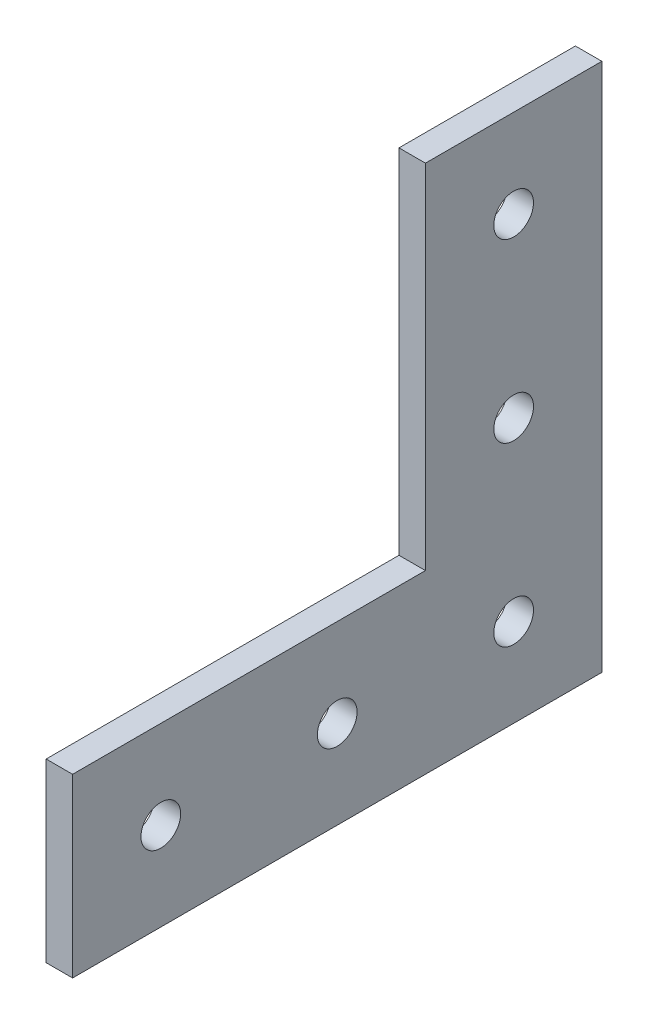
ISO-10303-21;
HEADER;
FILE_DESCRIPTION(('STEP AP214'),'2;1');
FILE_NAME('part.step','',(''),(''),'','','');
FILE_SCHEMA(('AUTOMOTIVE_DESIGN { 1 0 10303 214 1 1 1 1 }'));
ENDSEC;
DATA;
#1=APPLICATION_CONTEXT('core data for automotive mechanical design processes');
#2=APPLICATION_PROTOCOL_DEFINITION('international standard','automotive_design',2000,#1);
#3=PRODUCT_CONTEXT('',#1,'mechanical');
#4=PRODUCT('Part','Part','',(#3));
#5=PRODUCT_RELATED_PRODUCT_CATEGORY('part','',(#4));
#6=PRODUCT_DEFINITION_FORMATION('','',#4);
#7=PRODUCT_DEFINITION_CONTEXT('part definition',#1,'design');
#8=PRODUCT_DEFINITION('design','',#6,#7);
#9=PRODUCT_DEFINITION_SHAPE('','',#8);
#10=(LENGTH_UNIT() NAMED_UNIT(*) SI_UNIT(.MILLI.,.METRE.));
#11=(NAMED_UNIT(*) PLANE_ANGLE_UNIT() SI_UNIT($,.RADIAN.));
#12=(NAMED_UNIT(*) SI_UNIT($,.STERADIAN.) SOLID_ANGLE_UNIT());
#13=UNCERTAINTY_MEASURE_WITH_UNIT(LENGTH_MEASURE(1.E-05),#10,'distance_accuracy_value','');
#14=(GEOMETRIC_REPRESENTATION_CONTEXT(3) GLOBAL_UNCERTAINTY_ASSIGNED_CONTEXT((#13)) GLOBAL_UNIT_ASSIGNED_CONTEXT((#10,
#11,#12)) REPRESENTATION_CONTEXT('',''));
#15=CARTESIAN_POINT('',(0.,0.,0.));
#16=DIRECTION('',(0.,0.,1.));
#17=DIRECTION('',(1.,0.,0.));
#18=AXIS2_PLACEMENT_3D('',#15,#16,#17);
#19=CARTESIAN_POINT('',(6.0031,46.666666666667,46.666666666667));
#20=DIRECTION('',(1.,0.,0.));
#21=DIRECTION('',(0.,0.,-1.));
#22=AXIS2_PLACEMENT_3D('',#19,#20,#21);
#23=PLANE('',#22);
#24=CARTESIAN_POINT('',(6.0031,20.,100.));
#25=DIRECTION('',(1.,0.,0.));
#26=DIRECTION('',(0.,0.,-1.));
#27=AXIS2_PLACEMENT_3D('',#24,#25,#26);
#28=CIRCLE('',#27,4.5);
#29=CARTESIAN_POINT('',(6.0031,20.,95.5));
#30=VERTEX_POINT('',#29);
#31=EDGE_CURVE('E103',#30,#30,#28,.F.);
#32=ORIENTED_EDGE('',*,*,#31,.T.);
#33=EDGE_LOOP('',(#32));
#34=FACE_BOUND('',#33,.T.);
#35=CARTESIAN_POINT('',(6.0031,20.,60.));
#36=DIRECTION('',(1.,0.,0.));
#37=DIRECTION('',(0.,0.,-1.));
#38=AXIS2_PLACEMENT_3D('',#35,#36,#37);
#39=CIRCLE('',#38,4.5);
#40=CARTESIAN_POINT('',(6.0031,20.,55.5));
#41=VERTEX_POINT('',#40);
#42=EDGE_CURVE('E106',#41,#41,#39,.F.);
#43=ORIENTED_EDGE('',*,*,#42,.T.);
#44=EDGE_LOOP('',(#43));
#45=FACE_BOUND('',#44,.T.);
#46=CARTESIAN_POINT('',(6.0031,100.,20.));
#47=DIRECTION('',(1.,0.,0.));
#48=DIRECTION('',(0.,0.,-1.));
#49=AXIS2_PLACEMENT_3D('',#46,#47,#48);
#50=CIRCLE('',#49,4.5);
#51=CARTESIAN_POINT('',(6.0031,100.,15.5));
#52=VERTEX_POINT('',#51);
#53=EDGE_CURVE('E109',#52,#52,#50,.F.);
#54=ORIENTED_EDGE('',*,*,#53,.T.);
#55=EDGE_LOOP('',(#54));
#56=FACE_BOUND('',#55,.T.);
#57=CARTESIAN_POINT('',(6.0031,60.,20.));
#58=DIRECTION('',(1.,0.,0.));
#59=DIRECTION('',(0.,0.,-1.));
#60=AXIS2_PLACEMENT_3D('',#57,#58,#59);
#61=CIRCLE('',#60,4.5);
#62=CARTESIAN_POINT('',(6.0031,60.,15.5));
#63=VERTEX_POINT('',#62);
#64=EDGE_CURVE('E111',#63,#63,#61,.F.);
#65=ORIENTED_EDGE('',*,*,#64,.T.);
#66=EDGE_LOOP('',(#65));
#67=FACE_BOUND('',#66,.T.);
#68=CARTESIAN_POINT('',(6.0031,20.,20.));
#69=DIRECTION('',(1.,0.,0.));
#70=DIRECTION('',(0.,0.,-1.));
#71=AXIS2_PLACEMENT_3D('',#68,#69,#70);
#72=CIRCLE('',#71,4.5);
#73=CARTESIAN_POINT('',(6.0031,20.,15.5));
#74=VERTEX_POINT('',#73);
#75=EDGE_CURVE('E19',#74,#74,#72,.F.);
#76=ORIENTED_EDGE('',*,*,#75,.T.);
#77=EDGE_LOOP('',(#76));
#78=FACE_BOUND('',#77,.T.);
#79=DIRECTION('',(0.,1.,0.));
#80=VECTOR('',#79,1.);
#81=CARTESIAN_POINT('',(6.0031,40.,120.));
#82=LINE('',#81,#80);
#83=CARTESIAN_POINT('',(6.0031,40.,120.));
#84=VERTEX_POINT('',#83);
#85=CARTESIAN_POINT('',(6.0031,0.,120.));
#86=VERTEX_POINT('',#85);
#87=EDGE_CURVE('E125',#84,#86,#82,.F.);
#88=ORIENTED_EDGE('',*,*,#87,.T.);
#89=DIRECTION('',(0.,0.,1.));
#90=VECTOR('',#89,1.);
#91=CARTESIAN_POINT('',(6.0031,0.,120.));
#92=LINE('',#91,#90);
#93=CARTESIAN_POINT('',(6.0031,0.,0.));
#94=VERTEX_POINT('',#93);
#95=EDGE_CURVE('E71',#86,#94,#92,.F.);
#96=ORIENTED_EDGE('',*,*,#95,.T.);
#97=DIRECTION('',(0.,1.,0.));
#98=VECTOR('',#97,1.);
#99=CARTESIAN_POINT('',(6.0031,0.,0.));
#100=LINE('',#99,#98);
#101=CARTESIAN_POINT('',(6.0031,120.,0.));
#102=VERTEX_POINT('',#101);
#103=EDGE_CURVE('E70',#94,#102,#100,.T.);
#104=ORIENTED_EDGE('',*,*,#103,.T.);
#105=DIRECTION('',(0.,0.,-1.));
#106=VECTOR('',#105,1.);
#107=CARTESIAN_POINT('',(6.0031,120.,0.));
#108=LINE('',#107,#106);
#109=CARTESIAN_POINT('',(6.0031,120.,40.));
#110=VERTEX_POINT('',#109);
#111=EDGE_CURVE('E67',#102,#110,#108,.F.);
#112=ORIENTED_EDGE('',*,*,#111,.T.);
#113=DIRECTION('',(0.,1.,0.));
#114=VECTOR('',#113,1.);
#115=CARTESIAN_POINT('',(6.0031,120.,40.));
#116=LINE('',#115,#114);
#117=CARTESIAN_POINT('',(6.0031,40.,40.));
#118=VERTEX_POINT('',#117);
#119=EDGE_CURVE('E135',#110,#118,#116,.F.);
#120=ORIENTED_EDGE('',*,*,#119,.T.);
#121=DIRECTION('',(0.,0.,-1.));
#122=VECTOR('',#121,1.);
#123=CARTESIAN_POINT('',(6.0031,40.,40.));
#124=LINE('',#123,#122);
#125=EDGE_CURVE('E130',#118,#84,#124,.F.);
#126=ORIENTED_EDGE('',*,*,#125,.T.);
#127=EDGE_LOOP('',(#88,#96,#104,#112,#120,#126));
#128=FACE_BOUND('',#127,.T.);
#129=ADVANCED_FACE('F16',(#34,#45,#56,#67,#78,#128),#23,.T.);
#130=CARTESIAN_POINT('',(0.003099999999904,0.,0.));
#131=DIRECTION('',(0.,0.,1.));
#132=DIRECTION('',(1.,0.,0.));
#133=AXIS2_PLACEMENT_3D('',#130,#131,#132);
#134=PLANE('',#133);
#135=DIRECTION('',(1.,0.,0.));
#136=VECTOR('',#135,1.);
#137=CARTESIAN_POINT('',(0.003099999999904,120.,0.));
#138=LINE('',#137,#136);
#139=CARTESIAN_POINT('',(0.0030999999999895,120.,0.));
#140=VERTEX_POINT('',#139);
#141=EDGE_CURVE('E76',#140,#102,#138,.T.);
#142=ORIENTED_EDGE('',*,*,#141,.T.);
#143=ORIENTED_EDGE('',*,*,#103,.F.);
#144=DIRECTION('',(1.,0.,0.));
#145=VECTOR('',#144,1.);
#146=CARTESIAN_POINT('',(0.003099999999904,0.,0.));
#147=LINE('',#146,#145);
#148=CARTESIAN_POINT('',(0.0030999999999895,0.,0.));
#149=VERTEX_POINT('',#148);
#150=EDGE_CURVE('E116',#94,#149,#147,.F.);
#151=ORIENTED_EDGE('',*,*,#150,.T.);
#152=DIRECTION('',(0.,1.,0.));
#153=VECTOR('',#152,1.);
#154=CARTESIAN_POINT('',(0.003099999999904,46.666666666667,0.));
#155=LINE('',#154,#153);
#156=EDGE_CURVE('E87',#149,#140,#155,.T.);
#157=ORIENTED_EDGE('',*,*,#156,.T.);
#158=EDGE_LOOP('',(#142,#143,#151,#157));
#159=FACE_BOUND('',#158,.T.);
#160=ADVANCED_FACE('F86',(#159),#134,.F.);
#161=CARTESIAN_POINT('',(0.003099999999904,120.,0.));
#162=DIRECTION('',(0.,-1.,0.));
#163=DIRECTION('',(0.,0.,-1.));
#164=AXIS2_PLACEMENT_3D('',#161,#162,#163);
#165=PLANE('',#164);
#166=DIRECTION('',(-1.,0.,0.));
#167=VECTOR('',#166,1.);
#168=CARTESIAN_POINT('',(0.003099999999904,120.,40.));
#169=LINE('',#168,#167);
#170=CARTESIAN_POINT('',(0.0030999999999895,120.,40.));
#171=VERTEX_POINT('',#170);
#172=EDGE_CURVE('E83',#171,#110,#169,.F.);
#173=ORIENTED_EDGE('',*,*,#172,.T.);
#174=ORIENTED_EDGE('',*,*,#111,.F.);
#175=ORIENTED_EDGE('',*,*,#141,.F.);
#176=DIRECTION('',(0.,0.,-1.));
#177=VECTOR('',#176,1.);
#178=CARTESIAN_POINT('',(0.003099999999904,120.,46.666666666667));
#179=LINE('',#178,#177);
#180=EDGE_CURVE('E149',#140,#171,#179,.F.);
#181=ORIENTED_EDGE('',*,*,#180,.T.);
#182=EDGE_LOOP('',(#173,#174,#175,#181));
#183=FACE_BOUND('',#182,.T.);
#184=ADVANCED_FACE('F80',(#183),#165,.F.);
#185=CARTESIAN_POINT('',(0.003099999999904,120.,40.));
#186=DIRECTION('',(0.,0.,-1.));
#187=DIRECTION('',(-1.,0.,0.));
#188=AXIS2_PLACEMENT_3D('',#185,#186,#187);
#189=PLANE('',#188);
#190=DIRECTION('',(1.,0.,0.));
#191=VECTOR('',#190,1.);
#192=CARTESIAN_POINT('',(0.003099999999904,40.,40.));
#193=LINE('',#192,#191);
#194=CARTESIAN_POINT('',(0.0030999999999895,40.,40.));
#195=VERTEX_POINT('',#194);
#196=EDGE_CURVE('E132',#195,#118,#193,.T.);
#197=ORIENTED_EDGE('',*,*,#196,.T.);
#198=ORIENTED_EDGE('',*,*,#119,.F.);
#199=ORIENTED_EDGE('',*,*,#172,.F.);
#200=DIRECTION('',(0.,1.,0.));
#201=VECTOR('',#200,1.);
#202=CARTESIAN_POINT('',(0.003099999999904,46.666666666667,40.));
#203=LINE('',#202,#201);
#204=EDGE_CURVE('E146',#171,#195,#203,.F.);
#205=ORIENTED_EDGE('',*,*,#204,.T.);
#206=EDGE_LOOP('',(#197,#198,#199,#205));
#207=FACE_BOUND('',#206,.T.);
#208=ADVANCED_FACE('F144',(#207),#189,.F.);
#209=CARTESIAN_POINT('',(0.003099999999904,40.,40.));
#210=DIRECTION('',(0.,-1.,0.));
#211=DIRECTION('',(0.,0.,-1.));
#212=AXIS2_PLACEMENT_3D('',#209,#210,#211);
#213=PLANE('',#212);
#214=DIRECTION('',(-1.,0.,0.));
#215=VECTOR('',#214,1.);
#216=CARTESIAN_POINT('',(0.003099999999904,40.,120.));
#217=LINE('',#216,#215);
#218=CARTESIAN_POINT('',(0.0030999999999895,40.,120.));
#219=VERTEX_POINT('',#218);
#220=EDGE_CURVE('E127',#219,#84,#217,.F.);
#221=ORIENTED_EDGE('',*,*,#220,.T.);
#222=ORIENTED_EDGE('',*,*,#125,.F.);
#223=ORIENTED_EDGE('',*,*,#196,.F.);
#224=DIRECTION('',(0.,0.,-1.));
#225=VECTOR('',#224,1.);
#226=CARTESIAN_POINT('',(0.003099999999904,40.,46.666666666667));
#227=LINE('',#226,#225);
#228=EDGE_CURVE('E148',#195,#219,#227,.F.);
#229=ORIENTED_EDGE('',*,*,#228,.T.);
#230=EDGE_LOOP('',(#221,#222,#223,#229));
#231=FACE_BOUND('',#230,.T.);
#232=ADVANCED_FACE('F140',(#231),#213,.F.);
#233=CARTESIAN_POINT('',(0.003099999999904,40.,120.));
#234=DIRECTION('',(0.,0.,-1.));
#235=DIRECTION('',(-1.,0.,0.));
#236=AXIS2_PLACEMENT_3D('',#233,#234,#235);
#237=PLANE('',#236);
#238=DIRECTION('',(1.,0.,0.));
#239=VECTOR('',#238,1.);
#240=CARTESIAN_POINT('',(0.003099999999904,0.,120.));
#241=LINE('',#240,#239);
#242=CARTESIAN_POINT('',(0.0030999999999895,0.,120.));
#243=VERTEX_POINT('',#242);
#244=EDGE_CURVE('E34',#243,#86,#241,.T.);
#245=ORIENTED_EDGE('',*,*,#244,.T.);
#246=ORIENTED_EDGE('',*,*,#87,.F.);
#247=ORIENTED_EDGE('',*,*,#220,.F.);
#248=DIRECTION('',(0.,1.,0.));
#249=VECTOR('',#248,1.);
#250=CARTESIAN_POINT('',(0.003099999999904,46.666666666667,120.));
#251=LINE('',#250,#249);
#252=EDGE_CURVE('E151',#219,#243,#251,.F.);
#253=ORIENTED_EDGE('',*,*,#252,.T.);
#254=EDGE_LOOP('',(#245,#246,#247,#253));
#255=FACE_BOUND('',#254,.T.);
#256=ADVANCED_FACE('F160',(#255),#237,.F.);
#257=CARTESIAN_POINT('',(0.003099999999904,0.,120.));
#258=DIRECTION('',(0.,1.,0.));
#259=DIRECTION('',(0.,0.,1.));
#260=AXIS2_PLACEMENT_3D('',#257,#258,#259);
#261=PLANE('',#260);
#262=ORIENTED_EDGE('',*,*,#150,.F.);
#263=ORIENTED_EDGE('',*,*,#95,.F.);
#264=ORIENTED_EDGE('',*,*,#244,.F.);
#265=DIRECTION('',(0.,0.,-1.));
#266=VECTOR('',#265,1.);
#267=CARTESIAN_POINT('',(0.003099999999904,0.,46.666666666667));
#268=LINE('',#267,#266);
#269=EDGE_CURVE('E102',#243,#149,#268,.T.);
#270=ORIENTED_EDGE('',*,*,#269,.T.);
#271=EDGE_LOOP('',(#262,#263,#264,#270));
#272=FACE_BOUND('',#271,.T.);
#273=ADVANCED_FACE('F156',(#272),#261,.F.);
#274=CARTESIAN_POINT('',(0.003099999999904,20.,20.));
#275=DIRECTION('',(1.,0.,0.));
#276=DIRECTION('',(0.,0.,-1.));
#277=AXIS2_PLACEMENT_3D('',#274,#275,#276);
#278=CYLINDRICAL_SURFACE('',#277,4.5);
#279=CARTESIAN_POINT('',(0.003100000000018,20.,20.));
#280=DIRECTION('',(1.,0.,0.));
#281=DIRECTION('',(0.,0.,-1.));
#282=AXIS2_PLACEMENT_3D('',#279,#280,#281);
#283=CIRCLE('',#282,4.5);
#284=CARTESIAN_POINT('',(0.003100000000018,20.,15.5));
#285=VERTEX_POINT('',#284);
#286=EDGE_CURVE('E99',#285,#285,#283,.F.);
#287=ORIENTED_EDGE('',*,*,#286,.T.);
#288=EDGE_LOOP('',(#287));
#289=FACE_BOUND('',#288,.T.);
#290=ORIENTED_EDGE('',*,*,#75,.F.);
#291=EDGE_LOOP('',(#290));
#292=FACE_BOUND('',#291,.T.);
#293=ADVANCED_FACE('F168',(#289,#292),#278,.F.);
#294=CARTESIAN_POINT('',(0.003099999999904,60.,20.));
#295=DIRECTION('',(1.,0.,0.));
#296=DIRECTION('',(0.,0.,-1.));
#297=AXIS2_PLACEMENT_3D('',#294,#295,#296);
#298=CYLINDRICAL_SURFACE('',#297,4.5);
#299=CARTESIAN_POINT('',(0.003100000000018,60.,20.));
#300=DIRECTION('',(1.,0.,0.));
#301=DIRECTION('',(0.,0.,-1.));
#302=AXIS2_PLACEMENT_3D('',#299,#300,#301);
#303=CIRCLE('',#302,4.5);
#304=CARTESIAN_POINT('',(0.003100000000018,60.,15.5));
#305=VERTEX_POINT('',#304);
#306=EDGE_CURVE('E96',#305,#305,#303,.F.);
#307=ORIENTED_EDGE('',*,*,#306,.T.);
#308=EDGE_LOOP('',(#307));
#309=FACE_BOUND('',#308,.T.);
#310=ORIENTED_EDGE('',*,*,#64,.F.);
#311=EDGE_LOOP('',(#310));
#312=FACE_BOUND('',#311,.T.);
#313=ADVANCED_FACE('F190',(#309,#312),#298,.F.);
#314=CARTESIAN_POINT('',(0.003099999999904,100.,20.));
#315=DIRECTION('',(1.,0.,0.));
#316=DIRECTION('',(0.,0.,-1.));
#317=AXIS2_PLACEMENT_3D('',#314,#315,#316);
#318=CYLINDRICAL_SURFACE('',#317,4.5);
#319=CARTESIAN_POINT('',(0.003100000000018,100.,20.));
#320=DIRECTION('',(1.,0.,0.));
#321=DIRECTION('',(0.,0.,-1.));
#322=AXIS2_PLACEMENT_3D('',#319,#320,#321);
#323=CIRCLE('',#322,4.5);
#324=CARTESIAN_POINT('',(0.003100000000018,100.,15.5));
#325=VERTEX_POINT('',#324);
#326=EDGE_CURVE('E93',#325,#325,#323,.F.);
#327=ORIENTED_EDGE('',*,*,#326,.T.);
#328=EDGE_LOOP('',(#327));
#329=FACE_BOUND('',#328,.T.);
#330=ORIENTED_EDGE('',*,*,#53,.F.);
#331=EDGE_LOOP('',(#330));
#332=FACE_BOUND('',#331,.T.);
#333=ADVANCED_FACE('F186',(#329,#332),#318,.F.);
#334=CARTESIAN_POINT('',(0.003099999999904,20.,60.));
#335=DIRECTION('',(1.,0.,0.));
#336=DIRECTION('',(0.,0.,-1.));
#337=AXIS2_PLACEMENT_3D('',#334,#335,#336);
#338=CYLINDRICAL_SURFACE('',#337,4.5);
#339=CARTESIAN_POINT('',(0.003100000000018,20.,60.));
#340=DIRECTION('',(1.,0.,0.));
#341=DIRECTION('',(0.,0.,-1.));
#342=AXIS2_PLACEMENT_3D('',#339,#340,#341);
#343=CIRCLE('',#342,4.5);
#344=CARTESIAN_POINT('',(0.003100000000018,20.,55.5));
#345=VERTEX_POINT('',#344);
#346=EDGE_CURVE('E25',#345,#345,#343,.F.);
#347=ORIENTED_EDGE('',*,*,#346,.T.);
#348=EDGE_LOOP('',(#347));
#349=FACE_BOUND('',#348,.T.);
#350=ORIENTED_EDGE('',*,*,#42,.F.);
#351=EDGE_LOOP('',(#350));
#352=FACE_BOUND('',#351,.T.);
#353=ADVANCED_FACE('F178',(#349,#352),#338,.F.);
#354=CARTESIAN_POINT('',(0.003099999999904,20.,100.));
#355=DIRECTION('',(1.,0.,0.));
#356=DIRECTION('',(0.,0.,-1.));
#357=AXIS2_PLACEMENT_3D('',#354,#355,#356);
#358=CYLINDRICAL_SURFACE('',#357,4.5);
#359=CARTESIAN_POINT('',(0.003100000000018,20.,100.));
#360=DIRECTION('',(1.,0.,0.));
#361=DIRECTION('',(0.,0.,-1.));
#362=AXIS2_PLACEMENT_3D('',#359,#360,#361);
#363=CIRCLE('',#362,4.5);
#364=CARTESIAN_POINT('',(0.003100000000018,20.,95.5));
#365=VERTEX_POINT('',#364);
#366=EDGE_CURVE('E11',#365,#365,#363,.F.);
#367=ORIENTED_EDGE('',*,*,#366,.T.);
#368=EDGE_LOOP('',(#367));
#369=FACE_BOUND('',#368,.T.);
#370=ORIENTED_EDGE('',*,*,#31,.F.);
#371=EDGE_LOOP('',(#370));
#372=FACE_BOUND('',#371,.T.);
#373=ADVANCED_FACE('F172',(#369,#372),#358,.F.);
#374=CARTESIAN_POINT('',(0.003099999999904,46.666666666667,46.666666666667));
#375=DIRECTION('',(1.,0.,0.));
#376=DIRECTION('',(0.,0.,-1.));
#377=AXIS2_PLACEMENT_3D('',#374,#375,#376);
#378=PLANE('',#377);
#379=ORIENTED_EDGE('',*,*,#366,.F.);
#380=EDGE_LOOP('',(#379));
#381=FACE_BOUND('',#380,.T.);
#382=ORIENTED_EDGE('',*,*,#346,.F.);
#383=EDGE_LOOP('',(#382));
#384=FACE_BOUND('',#383,.T.);
#385=ORIENTED_EDGE('',*,*,#326,.F.);
#386=EDGE_LOOP('',(#385));
#387=FACE_BOUND('',#386,.T.);
#388=ORIENTED_EDGE('',*,*,#306,.F.);
#389=EDGE_LOOP('',(#388));
#390=FACE_BOUND('',#389,.T.);
#391=ORIENTED_EDGE('',*,*,#286,.F.);
#392=EDGE_LOOP('',(#391));
#393=FACE_BOUND('',#392,.T.);
#394=ORIENTED_EDGE('',*,*,#252,.F.);
#395=ORIENTED_EDGE('',*,*,#228,.F.);
#396=ORIENTED_EDGE('',*,*,#204,.F.);
#397=ORIENTED_EDGE('',*,*,#180,.F.);
#398=ORIENTED_EDGE('',*,*,#156,.F.);
#399=ORIENTED_EDGE('',*,*,#269,.F.);
#400=EDGE_LOOP('',(#394,#395,#396,#397,#398,#399));
#401=FACE_BOUND('',#400,.T.);
#402=ADVANCED_FACE('F158',(#381,#384,#387,#390,#393,#401),#378,.F.);
#403=CLOSED_SHELL('',(#129,#160,#184,#208,#232,#256,#273,#293,#313,#333,#353,#373,#402));
#404=MANIFOLD_SOLID_BREP('B1',#403);
#405=ADVANCED_BREP_SHAPE_REPRESENTATION('',(#18,#404),#14);
#406=SHAPE_DEFINITION_REPRESENTATION(#9,#405);
ENDSEC;
END-ISO-10303-21;
